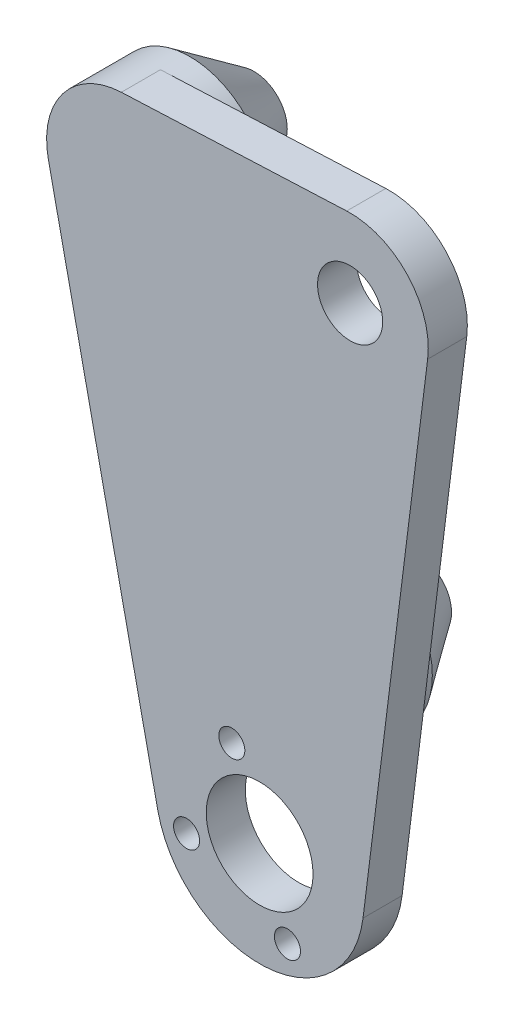
ISO-10303-21;
HEADER;
FILE_DESCRIPTION(('STEP AP214'),'2;1');
FILE_NAME('part.step','',(''),(''),'','','');
FILE_SCHEMA(('AUTOMOTIVE_DESIGN { 1 0 10303 214 1 1 1 1 }'));
ENDSEC;
DATA;
#1=APPLICATION_CONTEXT('core data for automotive mechanical design processes');
#2=APPLICATION_PROTOCOL_DEFINITION('international standard','automotive_design',2000,#1);
#3=PRODUCT_CONTEXT('',#1,'mechanical');
#4=PRODUCT('Part','Part','',(#3));
#5=PRODUCT_RELATED_PRODUCT_CATEGORY('part','',(#4));
#6=PRODUCT_DEFINITION_FORMATION('','',#4);
#7=PRODUCT_DEFINITION_CONTEXT('part definition',#1,'design');
#8=PRODUCT_DEFINITION('design','',#6,#7);
#9=PRODUCT_DEFINITION_SHAPE('','',#8);
#10=(LENGTH_UNIT() NAMED_UNIT(*) SI_UNIT(.MILLI.,.METRE.));
#11=(NAMED_UNIT(*) PLANE_ANGLE_UNIT() SI_UNIT($,.RADIAN.));
#12=(NAMED_UNIT(*) SI_UNIT($,.STERADIAN.) SOLID_ANGLE_UNIT());
#13=UNCERTAINTY_MEASURE_WITH_UNIT(LENGTH_MEASURE(1.E-05),#10,'distance_accuracy_value','');
#14=(GEOMETRIC_REPRESENTATION_CONTEXT(3) GLOBAL_UNCERTAINTY_ASSIGNED_CONTEXT((#13)) GLOBAL_UNIT_ASSIGNED_CONTEXT((#10,
#11,#12)) REPRESENTATION_CONTEXT('',''));
#15=CARTESIAN_POINT('',(0.,0.,0.));
#16=DIRECTION('',(0.,0.,1.));
#17=DIRECTION('',(1.,0.,0.));
#18=AXIS2_PLACEMENT_3D('',#15,#16,#17);
#19=CARTESIAN_POINT('',(0.,0.,3.));
#20=DIRECTION('',(0.,0.,-1.));
#21=DIRECTION('',(-1.,0.,0.));
#22=AXIS2_PLACEMENT_3D('',#19,#20,#21);
#23=CYLINDRICAL_SURFACE('',#22,8.);
#24=DIRECTION('',(0.,0.,-1.));
#25=VECTOR('',#24,1.);
#26=CARTESIAN_POINT('',(7.93806705488002,-0.993524751694006,3.));
#27=LINE('',#26,#25);
#28=CARTESIAN_POINT('',(7.93806705488002,-0.993524751694006,3.));
#29=VERTEX_POINT('',#28);
#30=CARTESIAN_POINT('',(7.93806705488002,-0.993524751694006,0.));
#31=VERTEX_POINT('',#30);
#32=EDGE_CURVE('E158',#29,#31,#27,.T.);
#33=ORIENTED_EDGE('',*,*,#32,.F.);
#34=CARTESIAN_POINT('',(0.,0.,3.));
#35=DIRECTION('',(0.,0.,1.));
#36=DIRECTION('',(1.,0.,0.));
#37=AXIS2_PLACEMENT_3D('',#34,#35,#36);
#38=CIRCLE('',#37,8.);
#39=CARTESIAN_POINT('',(-7.82126892549614,-1.68159222020933,3.));
#40=VERTEX_POINT('',#39);
#41=EDGE_CURVE('E165',#40,#29,#38,.T.);
#42=ORIENTED_EDGE('',*,*,#41,.F.);
#43=DIRECTION('',(0.,0.,-1.));
#44=VECTOR('',#43,1.);
#45=CARTESIAN_POINT('',(-7.82126892549614,-1.68159222020933,3.));
#46=LINE('',#45,#44);
#47=CARTESIAN_POINT('',(-7.82126892549614,-1.68159222020933,0.));
#48=VERTEX_POINT('',#47);
#49=EDGE_CURVE('E101',#40,#48,#46,.T.);
#50=ORIENTED_EDGE('',*,*,#49,.T.);
#51=CARTESIAN_POINT('',(0.,0.,0.));
#52=DIRECTION('',(0.,0.,1.));
#53=DIRECTION('',(1.,0.,0.));
#54=AXIS2_PLACEMENT_3D('',#51,#52,#53);
#55=CIRCLE('',#54,8.);
#56=EDGE_CURVE('E157',#48,#31,#55,.T.);
#57=ORIENTED_EDGE('',*,*,#56,.T.);
#58=EDGE_LOOP('',(#33,#42,#50,#57));
#59=FACE_BOUND('',#58,.T.);
#60=ADVANCED_FACE('F84',(#59),#23,.T.);
#61=CARTESIAN_POINT('',(-10.352761804101,38.6370330515627,3.));
#62=DIRECTION('',(0.,0.,-1.));
#63=DIRECTION('',(-1.,0.,0.));
#64=AXIS2_PLACEMENT_3D('',#61,#62,#63);
#65=CYLINDRICAL_SURFACE('',#64,6.);
#66=CARTESIAN_POINT('',(-10.352761804101,38.6370330515627,-1.99999999999998));
#67=DIRECTION('',(0.,0.,1.));
#68=DIRECTION('',(1.,0.,0.));
#69=AXIS2_PLACEMENT_3D('',#66,#67,#68);
#70=CIRCLE('',#69,6.);
#71=CARTESIAN_POINT('',(-4.352761804101,38.6370330515627,-1.99999999999998));
#72=VERTEX_POINT('',#71);
#73=EDGE_CURVE('E94',#72,#72,#70,.T.);
#74=ORIENTED_EDGE('',*,*,#73,.T.);
#75=EDGE_LOOP('',(#74));
#76=FACE_BOUND('',#75,.T.);
#77=DIRECTION('',(0.,0.,-1.));
#78=VECTOR('',#77,1.);
#79=CARTESIAN_POINT('',(-10.614478128293,44.6313223810538,3.));
#80=LINE('',#79,#78);
#81=CARTESIAN_POINT('',(-10.614478128293,44.6313223810538,3.));
#82=VERTEX_POINT('',#81);
#83=CARTESIAN_POINT('',(-10.614478128293,44.6313223810538,0.));
#84=VERTEX_POINT('',#83);
#85=EDGE_CURVE('E141',#82,#84,#80,.T.);
#86=ORIENTED_EDGE('',*,*,#85,.T.);
#87=CARTESIAN_POINT('',(-10.352761804101,38.6370330515627,0.));
#88=DIRECTION('',(0.,0.,1.));
#89=DIRECTION('',(1.,0.,0.));
#90=AXIS2_PLACEMENT_3D('',#87,#88,#89);
#91=CIRCLE('',#90,6.);
#92=CARTESIAN_POINT('',(-16.2187134982231,37.3758388864057,0.));
#93=VERTEX_POINT('',#92);
#94=EDGE_CURVE('E135',#93,#84,#91,.T.);
#95=ORIENTED_EDGE('',*,*,#94,.F.);
#96=DIRECTION('',(0.,0.,-1.));
#97=VECTOR('',#96,1.);
#98=CARTESIAN_POINT('',(-16.2187134982231,37.3758388864057,3.));
#99=LINE('',#98,#97);
#100=CARTESIAN_POINT('',(-16.2187134982231,37.3758388864057,3.));
#101=VERTEX_POINT('',#100);
#102=EDGE_CURVE('E139',#101,#93,#99,.T.);
#103=ORIENTED_EDGE('',*,*,#102,.F.);
#104=CARTESIAN_POINT('',(-10.352761804101,38.6370330515627,3.));
#105=DIRECTION('',(0.,0.,1.));
#106=DIRECTION('',(1.,0.,0.));
#107=AXIS2_PLACEMENT_3D('',#104,#105,#106);
#108=CIRCLE('',#107,6.);
#109=EDGE_CURVE('E160',#82,#101,#108,.T.);
#110=ORIENTED_EDGE('',*,*,#109,.F.);
#111=EDGE_LOOP('',(#86,#95,#103,#110));
#112=FACE_BOUND('',#111,.T.);
#113=ADVANCED_FACE('F137',(#76,#112),#65,.T.);
#114=CARTESIAN_POINT('',(-7.82126892549614,-1.68159222020933,3.));
#115=DIRECTION('',(-0.977658615687017,-0.210199027526166,0.));
#116=DIRECTION('',(0.210199027526166,-0.977658615687017,0.));
#117=AXIS2_PLACEMENT_3D('',#114,#115,#116);
#118=PLANE('',#117);
#119=DIRECTION('',(-0.210199027526166,0.977658615687017,0.));
#120=VECTOR('',#119,1.);
#121=CARTESIAN_POINT('',(-7.82126892549614,-1.68159222020933,0.));
#122=LINE('',#121,#120);
#123=EDGE_CURVE('E149',#48,#93,#122,.T.);
#124=ORIENTED_EDGE('',*,*,#123,.F.);
#125=ORIENTED_EDGE('',*,*,#49,.F.);
#126=DIRECTION('',(-0.210199027526166,0.977658615687017,0.));
#127=VECTOR('',#126,1.);
#128=CARTESIAN_POINT('',(-7.82126892549614,-1.68159222020933,3.));
#129=LINE('',#128,#127);
#130=EDGE_CURVE('E151',#40,#101,#129,.T.);
#131=ORIENTED_EDGE('',*,*,#130,.T.);
#132=ORIENTED_EDGE('',*,*,#102,.T.);
#133=EDGE_LOOP('',(#124,#125,#131,#132));
#134=FACE_BOUND('',#133,.T.);
#135=ADVANCED_FACE('F148',(#134),#118,.T.);
#136=CARTESIAN_POINT('',(0.,0.,0.));
#137=DIRECTION('',(0.,0.,1.));
#138=DIRECTION('',(1.,0.,0.));
#139=AXIS2_PLACEMENT_3D('',#136,#137,#138);
#140=PLANE('',#139);
#141=CARTESIAN_POINT('',(6.94592710667709,39.3923101204883,0.));
#142=DIRECTION('',(0.,0.,1.));
#143=DIRECTION('',(1.,0.,0.));
#144=AXIS2_PLACEMENT_3D('',#141,#142,#143);
#145=CIRCLE('',#144,2.5);
#146=CARTESIAN_POINT('',(9.44592710667709,39.3923101204883,0.));
#147=VERTEX_POINT('',#146);
#148=EDGE_CURVE('E358',#147,#147,#145,.T.);
#149=ORIENTED_EDGE('',*,*,#148,.T.);
#150=EDGE_LOOP('',(#149));
#151=FACE_BOUND('',#150,.T.);
#152=CARTESIAN_POINT('',(-5.60709258717361,-2.13553569833492,0.));
#153=DIRECTION('',(0.,0.,1.));
#154=DIRECTION('',(1.,0.,0.));
#155=AXIS2_PLACEMENT_3D('',#152,#153,#154);
#156=CIRCLE('',#155,1.);
#157=CARTESIAN_POINT('',(-4.60709258717361,-2.13553569833492,0.));
#158=VERTEX_POINT('',#157);
#159=EDGE_CURVE('E243',#158,#158,#156,.T.);
#160=ORIENTED_EDGE('',*,*,#159,.T.);
#161=EDGE_LOOP('',(#160));
#162=FACE_BOUND('',#161,.T.);
#163=CARTESIAN_POINT('',(-2.13553569833498,5.60709258717358,0.));
#164=DIRECTION('',(0.,0.,1.));
#165=DIRECTION('',(1.,0.,0.));
#166=AXIS2_PLACEMENT_3D('',#163,#164,#165);
#167=CIRCLE('',#166,1.);
#168=CARTESIAN_POINT('',(-1.13553569833498,5.60709258717358,0.));
#169=VERTEX_POINT('',#168);
#170=EDGE_CURVE('E364',#169,#169,#167,.T.);
#171=ORIENTED_EDGE('',*,*,#170,.T.);
#172=EDGE_LOOP('',(#171));
#173=FACE_BOUND('',#172,.T.);
#174=CARTESIAN_POINT('',(2.13553569833494,-5.6070925871736,0.));
#175=DIRECTION('',(0.,0.,1.));
#176=DIRECTION('',(1.,0.,0.));
#177=AXIS2_PLACEMENT_3D('',#174,#175,#176);
#178=CIRCLE('',#177,1.);
#179=CARTESIAN_POINT('',(3.13553569833494,-5.6070925871736,0.));
#180=VERTEX_POINT('',#179);
#181=EDGE_CURVE('E252',#180,#180,#178,.T.);
#182=ORIENTED_EDGE('',*,*,#181,.T.);
#183=EDGE_LOOP('',(#182));
#184=FACE_BOUND('',#183,.T.);
#185=CARTESIAN_POINT('',(2.25742630967006,12.8025007891587,0.));
#186=DIRECTION('',(0.,0.,1.));
#187=DIRECTION('',(1.,0.,0.));
#188=AXIS2_PLACEMENT_3D('',#185,#186,#187);
#189=CIRCLE('',#188,6.);
#190=CARTESIAN_POINT('',(8.25742630967006,12.8025007891587,0.));
#191=VERTEX_POINT('',#190);
#192=EDGE_CURVE('E240',#191,#191,#189,.T.);
#193=ORIENTED_EDGE('',*,*,#192,.T.);
#194=EDGE_LOOP('',(#193));
#195=FACE_BOUND('',#194,.T.);
#196=CARTESIAN_POINT('',(2.16755626400626,25.7016833681105,0.));
#197=DIRECTION('',(0.,0.,1.));
#198=DIRECTION('',(1.,0.,0.));
#199=AXIS2_PLACEMENT_3D('',#196,#197,#198);
#200=CIRCLE('',#199,6.);
#201=CARTESIAN_POINT('',(8.16755626400626,25.7016833681105,0.));
#202=VERTEX_POINT('',#201);
#203=EDGE_CURVE('E242',#202,#202,#200,.T.);
#204=ORIENTED_EDGE('',*,*,#203,.T.);
#205=EDGE_LOOP('',(#204));
#206=FACE_BOUND('',#205,.T.);
#207=CARTESIAN_POINT('',(0.,0.,0.));
#208=DIRECTION('',(0.,0.,1.));
#209=DIRECTION('',(1.,0.,0.));
#210=AXIS2_PLACEMENT_3D('',#207,#208,#209);
#211=CIRCLE('',#210,4.1);
#212=CARTESIAN_POINT('',(4.1,0.,0.));
#213=VERTEX_POINT('',#212);
#214=EDGE_CURVE('E257',#213,#213,#211,.T.);
#215=ORIENTED_EDGE('',*,*,#214,.T.);
#216=EDGE_LOOP('',(#215));
#217=FACE_BOUND('',#216,.T.);
#218=ORIENTED_EDGE('',*,*,#123,.T.);
#219=ORIENTED_EDGE('',*,*,#94,.T.);
#220=DIRECTION('',(-0.999048221581858,-0.0436193873653388,0.));
#221=VECTOR('',#220,1.);
#222=CARTESIAN_POINT('',(-1.96513367290395,45.0089609155167,0.));
#223=LINE('',#222,#221);
#224=CARTESIAN_POINT('',(6.68421078248506,45.3865994499795,0.));
#225=VERTEX_POINT('',#224);
#226=EDGE_CURVE('E264',#225,#84,#223,.T.);
#227=ORIENTED_EDGE('',*,*,#226,.F.);
#228=CARTESIAN_POINT('',(6.94592710667709,39.3923101204883,0.));
#229=DIRECTION('',(0.,0.,1.));
#230=DIRECTION('',(1.,0.,0.));
#231=AXIS2_PLACEMENT_3D('',#228,#229,#230);
#232=CIRCLE('',#231,6.);
#233=CARTESIAN_POINT('',(12.8994773978371,38.6471665567178,0.));
#234=VERTEX_POINT('',#233);
#235=EDGE_CURVE('E260',#234,#225,#232,.T.);
#236=ORIENTED_EDGE('',*,*,#235,.F.);
#237=DIRECTION('',(-0.124190593961751,-0.992258381860001,0.));
#238=VECTOR('',#237,1.);
#239=CARTESIAN_POINT('',(7.93806705488002,-0.993524751694006,0.));
#240=LINE('',#239,#238);
#241=EDGE_CURVE('E266',#234,#31,#240,.T.);
#242=ORIENTED_EDGE('',*,*,#241,.T.);
#243=ORIENTED_EDGE('',*,*,#56,.F.);
#244=EDGE_LOOP('',(#218,#219,#227,#236,#242,#243));
#245=FACE_BOUND('',#244,.T.);
#246=ADVANCED_FACE('F154',(#151,#162,#173,#184,#195,#206,#217,#245),#140,.F.);
#247=CARTESIAN_POINT('',(0.,0.,3.));
#248=DIRECTION('',(0.,0.,1.));
#249=DIRECTION('',(1.,0.,0.));
#250=AXIS2_PLACEMENT_3D('',#247,#248,#249);
#251=PLANE('',#250);
#252=CARTESIAN_POINT('',(6.94592710667709,39.3923101204883,3.));
#253=DIRECTION('',(0.,0.,1.));
#254=DIRECTION('',(1.,0.,0.));
#255=AXIS2_PLACEMENT_3D('',#252,#253,#254);
#256=CIRCLE('',#255,2.5);
#257=CARTESIAN_POINT('',(9.44592710667709,39.3923101204883,3.));
#258=VERTEX_POINT('',#257);
#259=EDGE_CURVE('E312',#258,#258,#256,.T.);
#260=ORIENTED_EDGE('',*,*,#259,.F.);
#261=EDGE_LOOP('',(#260));
#262=FACE_BOUND('',#261,.T.);
#263=CARTESIAN_POINT('',(-5.60709258717361,-2.13553569833492,3.));
#264=DIRECTION('',(0.,0.,1.));
#265=DIRECTION('',(1.,0.,0.));
#266=AXIS2_PLACEMENT_3D('',#263,#264,#265);
#267=CIRCLE('',#266,1.);
#268=CARTESIAN_POINT('',(-4.60709258717361,-2.13553569833492,3.));
#269=VERTEX_POINT('',#268);
#270=EDGE_CURVE('E249',#269,#269,#267,.T.);
#271=ORIENTED_EDGE('',*,*,#270,.F.);
#272=EDGE_LOOP('',(#271));
#273=FACE_BOUND('',#272,.T.);
#274=CARTESIAN_POINT('',(-2.13553569833498,5.60709258717358,3.));
#275=DIRECTION('',(0.,0.,1.));
#276=DIRECTION('',(1.,0.,0.));
#277=AXIS2_PLACEMENT_3D('',#274,#275,#276);
#278=CIRCLE('',#277,1.);
#279=CARTESIAN_POINT('',(-1.13553569833498,5.60709258717358,3.));
#280=VERTEX_POINT('',#279);
#281=EDGE_CURVE('E319',#280,#280,#278,.T.);
#282=ORIENTED_EDGE('',*,*,#281,.F.);
#283=EDGE_LOOP('',(#282));
#284=FACE_BOUND('',#283,.T.);
#285=CARTESIAN_POINT('',(2.13553569833494,-5.6070925871736,3.));
#286=DIRECTION('',(0.,0.,1.));
#287=DIRECTION('',(1.,0.,0.));
#288=AXIS2_PLACEMENT_3D('',#285,#286,#287);
#289=CIRCLE('',#288,1.);
#290=CARTESIAN_POINT('',(3.13553569833494,-5.6070925871736,3.));
#291=VERTEX_POINT('',#290);
#292=EDGE_CURVE('E323',#291,#291,#289,.T.);
#293=ORIENTED_EDGE('',*,*,#292,.F.);
#294=EDGE_LOOP('',(#293));
#295=FACE_BOUND('',#294,.T.);
#296=CARTESIAN_POINT('',(0.,0.,3.));
#297=DIRECTION('',(0.,0.,1.));
#298=DIRECTION('',(1.,0.,0.));
#299=AXIS2_PLACEMENT_3D('',#296,#297,#298);
#300=CIRCLE('',#299,4.1);
#301=CARTESIAN_POINT('',(4.1,0.,3.));
#302=VERTEX_POINT('',#301);
#303=EDGE_CURVE('E246',#302,#302,#300,.T.);
#304=ORIENTED_EDGE('',*,*,#303,.F.);
#305=EDGE_LOOP('',(#304));
#306=FACE_BOUND('',#305,.T.);
#307=DIRECTION('',(-0.999048221581858,-0.0436193873653388,0.));
#308=VECTOR('',#307,1.);
#309=CARTESIAN_POINT('',(-1.96513367290395,45.0089609155167,3.));
#310=LINE('',#309,#308);
#311=CARTESIAN_POINT('',(6.68421078248506,45.3865994499795,3.));
#312=VERTEX_POINT('',#311);
#313=EDGE_CURVE('E263',#312,#82,#310,.T.);
#314=ORIENTED_EDGE('',*,*,#313,.T.);
#315=ORIENTED_EDGE('',*,*,#109,.T.);
#316=ORIENTED_EDGE('',*,*,#130,.F.);
#317=ORIENTED_EDGE('',*,*,#41,.T.);
#318=DIRECTION('',(-0.124190593961751,-0.992258381860001,0.));
#319=VECTOR('',#318,1.);
#320=CARTESIAN_POINT('',(7.93806705488002,-0.993524751694006,3.));
#321=LINE('',#320,#319);
#322=CARTESIAN_POINT('',(12.8994773978371,38.6471665567178,3.));
#323=VERTEX_POINT('',#322);
#324=EDGE_CURVE('E261',#323,#29,#321,.T.);
#325=ORIENTED_EDGE('',*,*,#324,.F.);
#326=CARTESIAN_POINT('',(6.94592710667709,39.3923101204883,3.));
#327=DIRECTION('',(0.,0.,1.));
#328=DIRECTION('',(1.,0.,0.));
#329=AXIS2_PLACEMENT_3D('',#326,#327,#328);
#330=CIRCLE('',#329,6.);
#331=EDGE_CURVE('E268',#323,#312,#330,.T.);
#332=ORIENTED_EDGE('',*,*,#331,.T.);
#333=EDGE_LOOP('',(#314,#315,#316,#317,#325,#332));
#334=FACE_BOUND('',#333,.T.);
#335=ADVANCED_FACE('F281',(#262,#273,#284,#295,#306,#334),#251,.T.);
#336=CARTESIAN_POINT('',(7.93806705488002,-0.993524751694006,3.));
#337=DIRECTION('',(0.992258381860001,-0.124190593961751,0.));
#338=DIRECTION('',(0.124190593961751,0.992258381860001,0.));
#339=AXIS2_PLACEMENT_3D('',#336,#337,#338);
#340=PLANE('',#339);
#341=ORIENTED_EDGE('',*,*,#241,.F.);
#342=DIRECTION('',(0.,0.,-1.));
#343=VECTOR('',#342,1.);
#344=CARTESIAN_POINT('',(12.8994773978371,38.6471665567178,3.));
#345=LINE('',#344,#343);
#346=EDGE_CURVE('E162',#323,#234,#345,.T.);
#347=ORIENTED_EDGE('',*,*,#346,.F.);
#348=ORIENTED_EDGE('',*,*,#324,.T.);
#349=ORIENTED_EDGE('',*,*,#32,.T.);
#350=EDGE_LOOP('',(#341,#347,#348,#349));
#351=FACE_BOUND('',#350,.T.);
#352=ADVANCED_FACE('F284',(#351),#340,.T.);
#353=CARTESIAN_POINT('',(-1.96513367290395,45.0089609155167,3.));
#354=DIRECTION('',(0.0436193873653388,-0.999048221581858,0.));
#355=DIRECTION('',(0.999048221581858,0.0436193873653388,0.));
#356=AXIS2_PLACEMENT_3D('',#353,#354,#355);
#357=PLANE('',#356);
#358=ORIENTED_EDGE('',*,*,#226,.T.);
#359=ORIENTED_EDGE('',*,*,#85,.F.);
#360=ORIENTED_EDGE('',*,*,#313,.F.);
#361=DIRECTION('',(0.,0.,-1.));
#362=VECTOR('',#361,1.);
#363=CARTESIAN_POINT('',(6.68421078248506,45.3865994499795,3.));
#364=LINE('',#363,#362);
#365=EDGE_CURVE('E271',#312,#225,#364,.T.);
#366=ORIENTED_EDGE('',*,*,#365,.T.);
#367=EDGE_LOOP('',(#358,#359,#360,#366));
#368=FACE_BOUND('',#367,.T.);
#369=ADVANCED_FACE('F291',(#368),#357,.F.);
#370=CARTESIAN_POINT('',(6.94592710667709,39.3923101204883,3.));
#371=DIRECTION('',(0.,0.,-1.));
#372=DIRECTION('',(-1.,0.,0.));
#373=AXIS2_PLACEMENT_3D('',#370,#371,#372);
#374=CYLINDRICAL_SURFACE('',#373,6.);
#375=ORIENTED_EDGE('',*,*,#346,.T.);
#376=ORIENTED_EDGE('',*,*,#235,.T.);
#377=ORIENTED_EDGE('',*,*,#365,.F.);
#378=ORIENTED_EDGE('',*,*,#331,.F.);
#379=EDGE_LOOP('',(#375,#376,#377,#378));
#380=FACE_BOUND('',#379,.T.);
#381=ADVANCED_FACE('F287',(#380),#374,.T.);
#382=CARTESIAN_POINT('',(0.,0.,-47.));
#383=DIRECTION('',(0.,0.,1.));
#384=DIRECTION('',(1.,0.,0.));
#385=AXIS2_PLACEMENT_3D('',#382,#383,#384);
#386=CYLINDRICAL_SURFACE('',#385,4.1);
#387=ORIENTED_EDGE('',*,*,#303,.T.);
#388=EDGE_LOOP('',(#387));
#389=FACE_BOUND('',#388,.T.);
#390=ORIENTED_EDGE('',*,*,#214,.F.);
#391=EDGE_LOOP('',(#390));
#392=FACE_BOUND('',#391,.T.);
#393=ADVANCED_FACE('F297',(#389,#392),#386,.F.);
#394=CARTESIAN_POINT('',(2.16755626400626,25.7016833681105,-7.));
#395=DIRECTION('',(0.,0.,1.));
#396=DIRECTION('',(1.,0.,0.));
#397=AXIS2_PLACEMENT_3D('',#394,#395,#396);
#398=CYLINDRICAL_SURFACE('',#397,6.);
#399=CARTESIAN_POINT('',(2.16755626400626,25.7016833681105,-1.99999999999998));
#400=DIRECTION('',(0.,0.,1.));
#401=DIRECTION('',(1.,0.,0.));
#402=AXIS2_PLACEMENT_3D('',#399,#400,#401);
#403=CIRCLE('',#402,6.);
#404=CARTESIAN_POINT('',(8.16755626400626,25.7016833681105,-1.99999999999998));
#405=VERTEX_POINT('',#404);
#406=EDGE_CURVE('E174',#405,#405,#403,.T.);
#407=ORIENTED_EDGE('',*,*,#406,.T.);
#408=EDGE_LOOP('',(#407));
#409=FACE_BOUND('',#408,.T.);
#410=ORIENTED_EDGE('',*,*,#203,.F.);
#411=EDGE_LOOP('',(#410));
#412=FACE_BOUND('',#411,.T.);
#413=ADVANCED_FACE('F236',(#409,#412),#398,.T.);
#414=CARTESIAN_POINT('',(2.25742630967006,12.8025007891587,-7.));
#415=DIRECTION('',(0.,0.,1.));
#416=DIRECTION('',(1.,0.,0.));
#417=AXIS2_PLACEMENT_3D('',#414,#415,#416);
#418=CYLINDRICAL_SURFACE('',#417,6.);
#419=CARTESIAN_POINT('',(2.25742630967006,12.8025007891587,-1.99999999999998));
#420=DIRECTION('',(0.,0.,1.));
#421=DIRECTION('',(1.,0.,0.));
#422=AXIS2_PLACEMENT_3D('',#419,#420,#421);
#423=CIRCLE('',#422,6.);
#424=CARTESIAN_POINT('',(8.25742630967006,12.8025007891587,-1.99999999999998));
#425=VERTEX_POINT('',#424);
#426=EDGE_CURVE('E146',#425,#425,#423,.T.);
#427=ORIENTED_EDGE('',*,*,#426,.T.);
#428=EDGE_LOOP('',(#427));
#429=FACE_BOUND('',#428,.T.);
#430=ORIENTED_EDGE('',*,*,#192,.F.);
#431=EDGE_LOOP('',(#430));
#432=FACE_BOUND('',#431,.T.);
#433=ADVANCED_FACE('F232',(#429,#432),#418,.T.);
#434=CARTESIAN_POINT('',(-10.352761804101,38.6370330515627,-10.));
#435=DIRECTION('',(0.,1.,0.));
#436=DIRECTION('',(0.,0.,-1.));
#437=AXIS2_PLACEMENT_3D('',#434,#435,#436);
#438=SPHERICAL_SURFACE('',#437,4.);
#439=CARTESIAN_POINT('',(-10.352761804101,38.6370330515627,-10.));
#440=DIRECTION('',(0.,0.,1.));
#441=DIRECTION('',(1.,0.,0.));
#442=AXIS2_PLACEMENT_3D('',#439,#440,#441);
#443=SPHERICAL_SURFACE('',#442,4.);
#444=CARTESIAN_POINT('',(-10.352761804101,38.6370330515627,-6.92147057076465));
#445=DIRECTION('',(0.,0.,1.));
#446=DIRECTION('',(1.,0.,0.));
#447=AXIS2_PLACEMENT_3D('',#444,#445,#446);
#448=CIRCLE('',#447,2.55394920727329);
#449=CARTESIAN_POINT('',(-7.79881259682771,38.6370330515627,-6.92147057076465));
#450=VERTEX_POINT('',#449);
#451=EDGE_CURVE('E12',#450,#450,#448,.F.);
#452=ORIENTED_EDGE('',*,*,#451,.T.);
#453=EDGE_LOOP('',(#452));
#454=FACE_BOUND('',#453,.T.);
#455=ADVANCED_FACE('F235',(#454),#443,.F.);
#456=CARTESIAN_POINT('',(2.16755626400626,25.7016833681105,-10.));
#457=DIRECTION('',(0.,1.,0.));
#458=DIRECTION('',(0.,0.,-1.));
#459=AXIS2_PLACEMENT_3D('',#456,#457,#458);
#460=SPHERICAL_SURFACE('',#459,4.);
#461=CARTESIAN_POINT('',(2.16755626400626,25.7016833681105,-10.));
#462=DIRECTION('',(0.,0.,1.));
#463=DIRECTION('',(1.,0.,0.));
#464=AXIS2_PLACEMENT_3D('',#461,#462,#463);
#465=SPHERICAL_SURFACE('',#464,4.);
#466=CARTESIAN_POINT('',(2.16755626400626,25.7016833681105,-6.92147057076465));
#467=DIRECTION('',(0.,0.,1.));
#468=DIRECTION('',(1.,0.,0.));
#469=AXIS2_PLACEMENT_3D('',#466,#467,#468);
#470=CIRCLE('',#469,2.55394920727329);
#471=CARTESIAN_POINT('',(4.72150547127955,25.7016833681105,-6.92147057076465));
#472=VERTEX_POINT('',#471);
#473=EDGE_CURVE('E177',#472,#472,#470,.F.);
#474=ORIENTED_EDGE('',*,*,#473,.T.);
#475=EDGE_LOOP('',(#474));
#476=FACE_BOUND('',#475,.T.);
#477=ADVANCED_FACE('F225',(#476),#465,.F.);
#478=CARTESIAN_POINT('',(2.25742630967006,12.8025007891587,-10.));
#479=DIRECTION('',(0.,1.,0.));
#480=DIRECTION('',(0.,0.,-1.));
#481=AXIS2_PLACEMENT_3D('',#478,#479,#480);
#482=SPHERICAL_SURFACE('',#481,4.);
#483=CARTESIAN_POINT('',(2.25742630967006,12.8025007891587,-10.));
#484=DIRECTION('',(0.,0.,1.));
#485=DIRECTION('',(1.,0.,0.));
#486=AXIS2_PLACEMENT_3D('',#483,#484,#485);
#487=SPHERICAL_SURFACE('',#486,4.);
#488=CARTESIAN_POINT('',(2.25742630967006,12.8025007891587,-6.92147057076465));
#489=DIRECTION('',(0.,0.,1.));
#490=DIRECTION('',(1.,0.,0.));
#491=AXIS2_PLACEMENT_3D('',#488,#489,#490);
#492=CIRCLE('',#491,2.55394920727329);
#493=CARTESIAN_POINT('',(4.81137551694334,12.8025007891587,-6.92147057076465));
#494=VERTEX_POINT('',#493);
#495=EDGE_CURVE('E171',#494,#494,#492,.F.);
#496=ORIENTED_EDGE('',*,*,#495,.T.);
#497=EDGE_LOOP('',(#496));
#498=FACE_BOUND('',#497,.T.);
#499=ADVANCED_FACE('F216',(#498),#487,.F.);
#500=CARTESIAN_POINT('',(2.25742630967006,12.8025007891587,-1.99999999999998));
#501=DIRECTION('',(0.,0.,1.));
#502=DIRECTION('',(1.,0.,0.));
#503=AXIS2_PLACEMENT_3D('',#500,#501,#502);
#504=CONICAL_SURFACE('',#503,6.,0.610865238198022);
#505=ORIENTED_EDGE('',*,*,#495,.F.);
#506=EDGE_LOOP('',(#505));
#507=FACE_BOUND('',#506,.T.);
#508=ORIENTED_EDGE('',*,*,#426,.F.);
#509=EDGE_LOOP('',(#508));
#510=FACE_BOUND('',#509,.T.);
#511=ADVANCED_FACE('F194',(#507,#510),#504,.T.);
#512=CARTESIAN_POINT('',(2.16755626400626,25.7016833681105,-1.99999999999998));
#513=DIRECTION('',(0.,0.,1.));
#514=DIRECTION('',(1.,0.,0.));
#515=AXIS2_PLACEMENT_3D('',#512,#513,#514);
#516=CONICAL_SURFACE('',#515,6.,0.610865238198022);
#517=ORIENTED_EDGE('',*,*,#473,.F.);
#518=EDGE_LOOP('',(#517));
#519=FACE_BOUND('',#518,.T.);
#520=ORIENTED_EDGE('',*,*,#406,.F.);
#521=EDGE_LOOP('',(#520));
#522=FACE_BOUND('',#521,.T.);
#523=ADVANCED_FACE('F185',(#519,#522),#516,.T.);
#524=CARTESIAN_POINT('',(-10.352761804101,38.6370330515627,-1.99999999999998));
#525=DIRECTION('',(0.,0.,1.));
#526=DIRECTION('',(1.,0.,0.));
#527=AXIS2_PLACEMENT_3D('',#524,#525,#526);
#528=CONICAL_SURFACE('',#527,6.,0.610865238198022);
#529=ORIENTED_EDGE('',*,*,#451,.F.);
#530=EDGE_LOOP('',(#529));
#531=FACE_BOUND('',#530,.T.);
#532=ORIENTED_EDGE('',*,*,#73,.F.);
#533=EDGE_LOOP('',(#532));
#534=FACE_BOUND('',#533,.T.);
#535=ADVANCED_FACE('F87',(#531,#534),#528,.T.);
#536=CARTESIAN_POINT('',(2.13553569833494,-5.6070925871736,0.));
#537=DIRECTION('',(0.,0.,1.));
#538=DIRECTION('',(1.,0.,0.));
#539=AXIS2_PLACEMENT_3D('',#536,#537,#538);
#540=CYLINDRICAL_SURFACE('',#539,1.);
#541=ORIENTED_EDGE('',*,*,#181,.F.);
#542=EDGE_LOOP('',(#541));
#543=FACE_BOUND('',#542,.T.);
#544=ORIENTED_EDGE('',*,*,#292,.T.);
#545=EDGE_LOOP('',(#544));
#546=FACE_BOUND('',#545,.T.);
#547=ADVANCED_FACE('F184',(#543,#546),#540,.F.);
#548=CARTESIAN_POINT('',(-2.13553569833498,5.60709258717358,0.));
#549=DIRECTION('',(0.,0.,1.));
#550=DIRECTION('',(1.,0.,0.));
#551=AXIS2_PLACEMENT_3D('',#548,#549,#550);
#552=CYLINDRICAL_SURFACE('',#551,1.);
#553=ORIENTED_EDGE('',*,*,#170,.F.);
#554=EDGE_LOOP('',(#553));
#555=FACE_BOUND('',#554,.T.);
#556=ORIENTED_EDGE('',*,*,#281,.T.);
#557=EDGE_LOOP('',(#556));
#558=FACE_BOUND('',#557,.T.);
#559=ADVANCED_FACE('F191',(#555,#558),#552,.F.);
#560=CARTESIAN_POINT('',(-5.60709258717361,-2.13553569833492,0.));
#561=DIRECTION('',(0.,0.,1.));
#562=DIRECTION('',(1.,0.,0.));
#563=AXIS2_PLACEMENT_3D('',#560,#561,#562);
#564=CYLINDRICAL_SURFACE('',#563,1.);
#565=ORIENTED_EDGE('',*,*,#159,.F.);
#566=EDGE_LOOP('',(#565));
#567=FACE_BOUND('',#566,.T.);
#568=ORIENTED_EDGE('',*,*,#270,.T.);
#569=EDGE_LOOP('',(#568));
#570=FACE_BOUND('',#569,.T.);
#571=ADVANCED_FACE('F346',(#567,#570),#564,.F.);
#572=CARTESIAN_POINT('',(6.94592710667709,39.3923101204883,0.));
#573=DIRECTION('',(0.,0.,1.));
#574=DIRECTION('',(1.,0.,0.));
#575=AXIS2_PLACEMENT_3D('',#572,#573,#574);
#576=CYLINDRICAL_SURFACE('',#575,2.5);
#577=ORIENTED_EDGE('',*,*,#148,.F.);
#578=EDGE_LOOP('',(#577));
#579=FACE_BOUND('',#578,.T.);
#580=ORIENTED_EDGE('',*,*,#259,.T.);
#581=EDGE_LOOP('',(#580));
#582=FACE_BOUND('',#581,.T.);
#583=ADVANCED_FACE('F350',(#579,#582),#576,.F.);
#584=CLOSED_SHELL('',(#60,#113,#135,#246,#335,#352,#369,#381,#393,#413,#433,#455,#477,#499,#511,
#523,#535,#547,#559,#571,#583));
#585=MANIFOLD_SOLID_BREP('B2',#584);
#586=ADVANCED_BREP_SHAPE_REPRESENTATION('',(#18,#585),#14);
#587=SHAPE_DEFINITION_REPRESENTATION(#9,#586);
ENDSEC;
END-ISO-10303-21;
